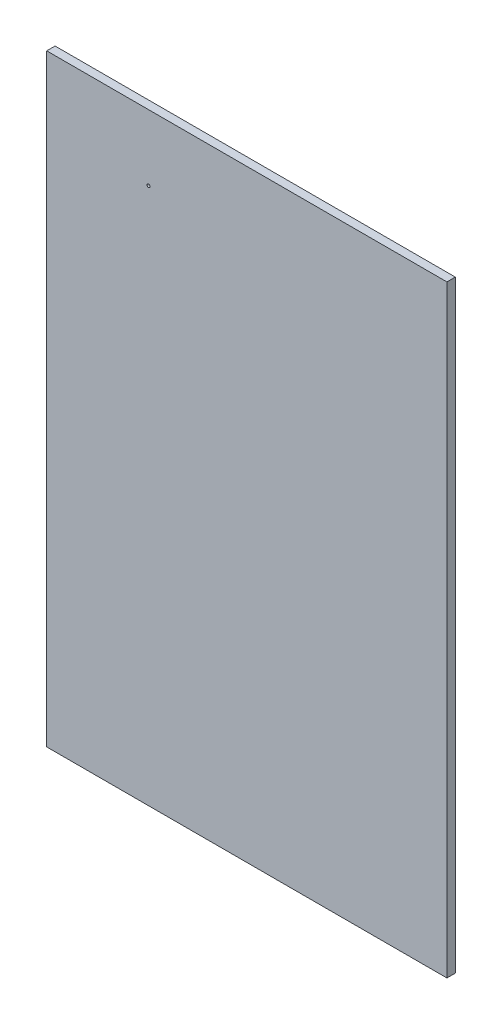
ISO-10303-21;
HEADER;
FILE_DESCRIPTION(('STEP AP214'),'2;1');
FILE_NAME('part.step','',(''),(''),'','','');
FILE_SCHEMA(('AUTOMOTIVE_DESIGN { 1 0 10303 214 1 1 1 1 }'));
ENDSEC;
DATA;
#1=APPLICATION_CONTEXT('core data for automotive mechanical design processes');
#2=APPLICATION_PROTOCOL_DEFINITION('international standard','automotive_design',2000,#1);
#3=PRODUCT_CONTEXT('',#1,'mechanical');
#4=PRODUCT('Part','Part','',(#3));
#5=PRODUCT_RELATED_PRODUCT_CATEGORY('part','',(#4));
#6=PRODUCT_DEFINITION_FORMATION('','',#4);
#7=PRODUCT_DEFINITION_CONTEXT('part definition',#1,'design');
#8=PRODUCT_DEFINITION('design','',#6,#7);
#9=PRODUCT_DEFINITION_SHAPE('','',#8);
#10=(LENGTH_UNIT() NAMED_UNIT(*) SI_UNIT(.MILLI.,.METRE.));
#11=(NAMED_UNIT(*) PLANE_ANGLE_UNIT() SI_UNIT($,.RADIAN.));
#12=(NAMED_UNIT(*) SI_UNIT($,.STERADIAN.) SOLID_ANGLE_UNIT());
#13=UNCERTAINTY_MEASURE_WITH_UNIT(LENGTH_MEASURE(1.E-05),#10,'distance_accuracy_value','');
#14=(GEOMETRIC_REPRESENTATION_CONTEXT(3) GLOBAL_UNCERTAINTY_ASSIGNED_CONTEXT((#13)) GLOBAL_UNIT_ASSIGNED_CONTEXT((#10,
#11,#12)) REPRESENTATION_CONTEXT('',''));
#15=CARTESIAN_POINT('',(0.,0.,0.));
#16=DIRECTION('',(0.,0.,1.));
#17=DIRECTION('',(1.,0.,0.));
#18=AXIS2_PLACEMENT_3D('',#15,#16,#17);
#19=CARTESIAN_POINT('',(-600.,900.,25.));
#20=DIRECTION('',(0.,-1.,0.));
#21=DIRECTION('',(0.,0.,-1.));
#22=AXIS2_PLACEMENT_3D('',#19,#20,#21);
#23=PLANE('',#22);
#24=DIRECTION('',(0.,0.,1.));
#25=VECTOR('',#24,1.);
#26=CARTESIAN_POINT('',(595.,900.,25.));
#27=LINE('',#26,#25);
#28=CARTESIAN_POINT('',(595.,900.,0.));
#29=VERTEX_POINT('',#28);
#30=CARTESIAN_POINT('',(595.,900.,25.));
#31=VERTEX_POINT('',#30);
#32=EDGE_CURVE('E106',#29,#31,#27,.T.);
#33=ORIENTED_EDGE('',*,*,#32,.F.);
#34=DIRECTION('',(-1.,0.,0.));
#35=VECTOR('',#34,1.);
#36=CARTESIAN_POINT('',(-600.,900.,0.));
#37=LINE('',#36,#35);
#38=CARTESIAN_POINT('',(-600.,900.,0.));
#39=VERTEX_POINT('',#38);
#40=EDGE_CURVE('E82',#29,#39,#37,.T.);
#41=ORIENTED_EDGE('',*,*,#40,.T.);
#42=DIRECTION('',(0.,0.,-1.));
#43=VECTOR('',#42,1.);
#44=CARTESIAN_POINT('',(-600.,900.,25.));
#45=LINE('',#44,#43);
#46=CARTESIAN_POINT('',(-600.,900.,25.));
#47=VERTEX_POINT('',#46);
#48=EDGE_CURVE('E44',#47,#39,#45,.T.);
#49=ORIENTED_EDGE('',*,*,#48,.F.);
#50=DIRECTION('',(-1.,0.,0.));
#51=VECTOR('',#50,1.);
#52=CARTESIAN_POINT('',(-600.,900.,25.));
#53=LINE('',#52,#51);
#54=EDGE_CURVE('E90',#31,#47,#53,.T.);
#55=ORIENTED_EDGE('',*,*,#54,.F.);
#56=EDGE_LOOP('',(#33,#41,#49,#55));
#57=FACE_BOUND('',#56,.T.);
#58=ADVANCED_FACE('F37',(#57),#23,.F.);
#59=CARTESIAN_POINT('',(-600.,-900.,25.));
#60=DIRECTION('',(0.,1.,0.));
#61=DIRECTION('',(0.,0.,1.));
#62=AXIS2_PLACEMENT_3D('',#59,#60,#61);
#63=PLANE('',#62);
#64=DIRECTION('',(0.,0.,-1.));
#65=VECTOR('',#64,1.);
#66=CARTESIAN_POINT('',(595.,-900.,25.));
#67=LINE('',#66,#65);
#68=CARTESIAN_POINT('',(595.,-900.,25.));
#69=VERTEX_POINT('',#68);
#70=CARTESIAN_POINT('',(595.,-900.,0.));
#71=VERTEX_POINT('',#70);
#72=EDGE_CURVE('E50',#69,#71,#67,.T.);
#73=ORIENTED_EDGE('',*,*,#72,.F.);
#74=DIRECTION('',(1.,0.,0.));
#75=VECTOR('',#74,1.);
#76=CARTESIAN_POINT('',(-600.,-900.,25.));
#77=LINE('',#76,#75);
#78=CARTESIAN_POINT('',(-600.,-900.,25.));
#79=VERTEX_POINT('',#78);
#80=EDGE_CURVE('E87',#79,#69,#77,.T.);
#81=ORIENTED_EDGE('',*,*,#80,.F.);
#82=DIRECTION('',(0.,0.,-1.));
#83=VECTOR('',#82,1.);
#84=CARTESIAN_POINT('',(-600.,-900.,25.));
#85=LINE('',#84,#83);
#86=CARTESIAN_POINT('',(-600.,-900.,0.));
#87=VERTEX_POINT('',#86);
#88=EDGE_CURVE('E75',#79,#87,#85,.T.);
#89=ORIENTED_EDGE('',*,*,#88,.T.);
#90=DIRECTION('',(1.,0.,0.));
#91=VECTOR('',#90,1.);
#92=CARTESIAN_POINT('',(-600.,-900.,0.));
#93=LINE('',#92,#91);
#94=EDGE_CURVE('E81',#87,#71,#93,.T.);
#95=ORIENTED_EDGE('',*,*,#94,.T.);
#96=EDGE_LOOP('',(#73,#81,#89,#95));
#97=FACE_BOUND('',#96,.T.);
#98=ADVANCED_FACE('F86',(#97),#63,.F.);
#99=CARTESIAN_POINT('',(0.,0.,25.));
#100=DIRECTION('',(0.,0.,1.));
#101=DIRECTION('',(1.,0.,0.));
#102=AXIS2_PLACEMENT_3D('',#99,#100,#101);
#103=PLANE('',#102);
#104=CARTESIAN_POINT('',(-296.,703.,25.));
#105=DIRECTION('',(0.,0.,1.));
#106=DIRECTION('',(1.,0.,0.));
#107=AXIS2_PLACEMENT_3D('',#104,#105,#106);
#108=CIRCLE('',#107,4.50000000000002);
#109=CARTESIAN_POINT('',(-291.5,703.,25.));
#110=VERTEX_POINT('',#109);
#111=EDGE_CURVE('E98',#110,#110,#108,.T.);
#112=ORIENTED_EDGE('',*,*,#111,.F.);
#113=EDGE_LOOP('',(#112));
#114=FACE_BOUND('',#113,.T.);
#115=ORIENTED_EDGE('',*,*,#80,.T.);
#116=DIRECTION('',(0.,1.,0.));
#117=VECTOR('',#116,1.);
#118=CARTESIAN_POINT('',(595.,0.,25.));
#119=LINE('',#118,#117);
#120=EDGE_CURVE('E101',#69,#31,#119,.T.);
#121=ORIENTED_EDGE('',*,*,#120,.T.);
#122=ORIENTED_EDGE('',*,*,#54,.T.);
#123=DIRECTION('',(0.,-1.,0.));
#124=VECTOR('',#123,1.);
#125=CARTESIAN_POINT('',(-600.,900.,25.));
#126=LINE('',#125,#124);
#127=EDGE_CURVE('E59',#47,#79,#126,.T.);
#128=ORIENTED_EDGE('',*,*,#127,.T.);
#129=EDGE_LOOP('',(#115,#121,#122,#128));
#130=FACE_BOUND('',#129,.T.);
#131=ADVANCED_FACE('F115',(#114,#130),#103,.T.);
#132=CARTESIAN_POINT('',(0.,0.,0.));
#133=DIRECTION('',(0.,0.,1.));
#134=DIRECTION('',(1.,0.,0.));
#135=AXIS2_PLACEMENT_3D('',#132,#133,#134);
#136=PLANE('',#135);
#137=CARTESIAN_POINT('',(-296.,703.,0.));
#138=DIRECTION('',(0.,0.,1.));
#139=DIRECTION('',(1.,0.,0.));
#140=AXIS2_PLACEMENT_3D('',#137,#138,#139);
#141=CIRCLE('',#140,4.50000000000002);
#142=CARTESIAN_POINT('',(-291.5,703.,0.));
#143=VERTEX_POINT('',#142);
#144=EDGE_CURVE('E95',#143,#143,#141,.T.);
#145=ORIENTED_EDGE('',*,*,#144,.T.);
#146=EDGE_LOOP('',(#145));
#147=FACE_BOUND('',#146,.T.);
#148=DIRECTION('',(0.,1.,0.));
#149=VECTOR('',#148,1.);
#150=CARTESIAN_POINT('',(595.,0.,0.));
#151=LINE('',#150,#149);
#152=EDGE_CURVE('E11',#71,#29,#151,.T.);
#153=ORIENTED_EDGE('',*,*,#152,.F.);
#154=ORIENTED_EDGE('',*,*,#94,.F.);
#155=DIRECTION('',(0.,-1.,0.));
#156=VECTOR('',#155,1.);
#157=CARTESIAN_POINT('',(-600.,900.,0.));
#158=LINE('',#157,#156);
#159=EDGE_CURVE('E72',#39,#87,#158,.T.);
#160=ORIENTED_EDGE('',*,*,#159,.F.);
#161=ORIENTED_EDGE('',*,*,#40,.F.);
#162=EDGE_LOOP('',(#153,#154,#160,#161));
#163=FACE_BOUND('',#162,.T.);
#164=ADVANCED_FACE('F89',(#147,#163),#136,.F.);
#165=CARTESIAN_POINT('',(-600.,900.,25.));
#166=DIRECTION('',(1.,0.,0.));
#167=DIRECTION('',(0.,1.,0.));
#168=AXIS2_PLACEMENT_3D('',#165,#166,#167);
#169=PLANE('',#168);
#170=ORIENTED_EDGE('',*,*,#159,.T.);
#171=ORIENTED_EDGE('',*,*,#88,.F.);
#172=ORIENTED_EDGE('',*,*,#127,.F.);
#173=ORIENTED_EDGE('',*,*,#48,.T.);
#174=EDGE_LOOP('',(#170,#171,#172,#173));
#175=FACE_BOUND('',#174,.T.);
#176=ADVANCED_FACE('F74',(#175),#169,.F.);
#177=CARTESIAN_POINT('',(-296.,703.,0.));
#178=DIRECTION('',(0.,0.,1.));
#179=DIRECTION('',(1.,0.,0.));
#180=AXIS2_PLACEMENT_3D('',#177,#178,#179);
#181=CYLINDRICAL_SURFACE('',#180,4.50000000000002);
#182=ORIENTED_EDGE('',*,*,#144,.F.);
#183=EDGE_LOOP('',(#182));
#184=FACE_BOUND('',#183,.T.);
#185=ORIENTED_EDGE('',*,*,#111,.T.);
#186=EDGE_LOOP('',(#185));
#187=FACE_BOUND('',#186,.T.);
#188=ADVANCED_FACE('F130',(#184,#187),#181,.F.);
#189=CARTESIAN_POINT('',(595.,0.,0.));
#190=DIRECTION('',(1.,0.,0.));
#191=DIRECTION('',(0.,1.,0.));
#192=AXIS2_PLACEMENT_3D('',#189,#190,#191);
#193=PLANE('',#192);
#194=ORIENTED_EDGE('',*,*,#72,.T.);
#195=ORIENTED_EDGE('',*,*,#152,.T.);
#196=ORIENTED_EDGE('',*,*,#32,.T.);
#197=ORIENTED_EDGE('',*,*,#120,.F.);
#198=EDGE_LOOP('',(#194,#195,#196,#197));
#199=FACE_BOUND('',#198,.T.);
#200=ADVANCED_FACE('F110',(#199),#193,.T.);
#201=CLOSED_SHELL('',(#58,#98,#131,#164,#176,#188,#200));
#202=MANIFOLD_SOLID_BREP('B2',#201);
#203=ADVANCED_BREP_SHAPE_REPRESENTATION('',(#18,#202),#14);
#204=SHAPE_DEFINITION_REPRESENTATION(#9,#203);
ENDSEC;
END-ISO-10303-21;
